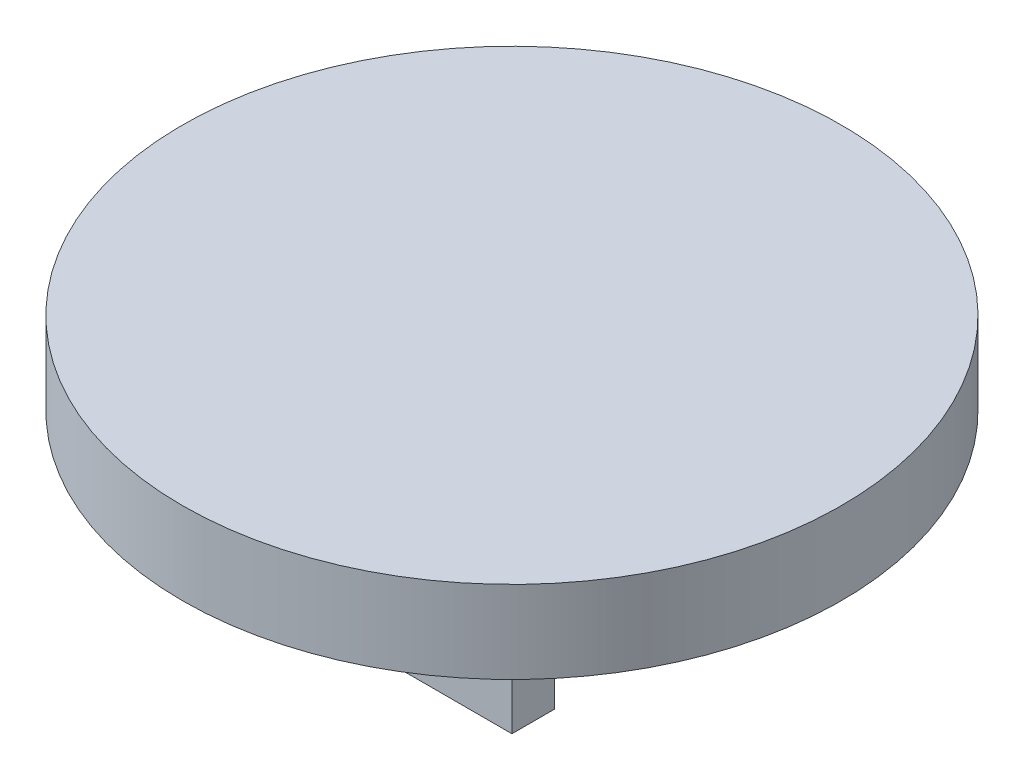
ISO-10303-21;
HEADER;
FILE_DESCRIPTION(('STEP AP214'),'2;1');
FILE_NAME('part.step','',(''),(''),'','','');
FILE_SCHEMA(('AUTOMOTIVE_DESIGN { 1 0 10303 214 1 1 1 1 }'));
ENDSEC;
DATA;
#1=APPLICATION_CONTEXT('core data for automotive mechanical design processes');
#2=APPLICATION_PROTOCOL_DEFINITION('international standard','automotive_design',2000,#1);
#3=PRODUCT_CONTEXT('',#1,'mechanical');
#4=PRODUCT('Part','Part','',(#3));
#5=PRODUCT_RELATED_PRODUCT_CATEGORY('part','',(#4));
#6=PRODUCT_DEFINITION_FORMATION('','',#4);
#7=PRODUCT_DEFINITION_CONTEXT('part definition',#1,'design');
#8=PRODUCT_DEFINITION('design','',#6,#7);
#9=PRODUCT_DEFINITION_SHAPE('','',#8);
#10=(LENGTH_UNIT() NAMED_UNIT(*) SI_UNIT(.MILLI.,.METRE.));
#11=(NAMED_UNIT(*) PLANE_ANGLE_UNIT() SI_UNIT($,.RADIAN.));
#12=(NAMED_UNIT(*) SI_UNIT($,.STERADIAN.) SOLID_ANGLE_UNIT());
#13=UNCERTAINTY_MEASURE_WITH_UNIT(LENGTH_MEASURE(1.E-05),#10,'distance_accuracy_value','');
#14=(GEOMETRIC_REPRESENTATION_CONTEXT(3) GLOBAL_UNCERTAINTY_ASSIGNED_CONTEXT((#13)) GLOBAL_UNIT_ASSIGNED_CONTEXT((#10,
#11,#12)) REPRESENTATION_CONTEXT('',''));
#15=CARTESIAN_POINT('',(0.,0.,0.));
#16=DIRECTION('',(0.,0.,1.));
#17=DIRECTION('',(1.,0.,0.));
#18=AXIS2_PLACEMENT_3D('',#15,#16,#17);
#19=CARTESIAN_POINT('',(0.,-3.,0.));
#20=DIRECTION('',(0.,-1.,0.));
#21=DIRECTION('',(0.,0.,-1.));
#22=AXIS2_PLACEMENT_3D('',#19,#20,#21);
#23=PLANE('',#22);
#24=DIRECTION('',(-1.,0.,0.));
#25=VECTOR('',#24,1.);
#26=CARTESIAN_POINT('',(0.,-3.,3.44343794684317));
#27=LINE('',#26,#25);
#28=CARTESIAN_POINT('',(-2.37672367471392,-3.,3.44343794684317));
#29=VERTEX_POINT('',#28);
#30=CARTESIAN_POINT('',(-5.,-3.,3.44343794684317));
#31=VERTEX_POINT('',#30);
#32=EDGE_CURVE('E192',#29,#31,#27,.T.);
#33=ORIENTED_EDGE('',*,*,#32,.F.);
#34=DIRECTION('',(0.,0.,-1.));
#35=VECTOR('',#34,1.);
#36=CARTESIAN_POINT('',(-2.37672367471392,-3.,0.));
#37=LINE('',#36,#35);
#38=CARTESIAN_POINT('',(-2.37672367471392,-3.,5.));
#39=VERTEX_POINT('',#38);
#40=EDGE_CURVE('E223',#39,#29,#37,.T.);
#41=ORIENTED_EDGE('',*,*,#40,.F.);
#42=DIRECTION('',(-1.,0.,0.));
#43=VECTOR('',#42,1.);
#44=CARTESIAN_POINT('',(-5.,-3.,5.));
#45=LINE('',#44,#43);
#46=CARTESIAN_POINT('',(-5.,-3.,5.));
#47=VERTEX_POINT('',#46);
#48=EDGE_CURVE('E239',#39,#47,#45,.T.);
#49=ORIENTED_EDGE('',*,*,#48,.T.);
#50=DIRECTION('',(0.,0.,-1.));
#51=VECTOR('',#50,1.);
#52=CARTESIAN_POINT('',(-5.,-3.,5.));
#53=LINE('',#52,#51);
#54=EDGE_CURVE('E242',#47,#31,#53,.T.);
#55=ORIENTED_EDGE('',*,*,#54,.T.);
#56=EDGE_LOOP('',(#33,#41,#49,#55));
#57=FACE_BOUND('',#56,.T.);
#58=ADVANCED_FACE('F33',(#57),#23,.T.);
#59=CARTESIAN_POINT('',(5.,-5.1951982939497,14.0225349811759));
#60=DIRECTION('',(0.,-1.,0.));
#61=DIRECTION('',(0.,0.,-1.));
#62=AXIS2_PLACEMENT_3D('',#59,#60,#61);
#63=PLANE('',#62);
#64=DIRECTION('',(-1.,0.,0.));
#65=VECTOR('',#64,1.);
#66=CARTESIAN_POINT('',(5.,-5.1951982939497,3.44343794684317));
#67=LINE('',#66,#65);
#68=CARTESIAN_POINT('',(5.,-5.1951982939497,3.44343794684317));
#69=VERTEX_POINT('',#68);
#70=CARTESIAN_POINT('',(-2.37672367471392,-5.1951982939497,3.44343794684317));
#71=VERTEX_POINT('',#70);
#72=EDGE_CURVE('E165',#69,#71,#67,.T.);
#73=ORIENTED_EDGE('',*,*,#72,.F.);
#74=DIRECTION('',(0.,0.,-1.));
#75=VECTOR('',#74,1.);
#76=CARTESIAN_POINT('',(5.,-5.1951982939497,14.0225349811759));
#77=LINE('',#76,#75);
#78=CARTESIAN_POINT('',(5.,-5.1951982939497,5.));
#79=VERTEX_POINT('',#78);
#80=EDGE_CURVE('E215',#79,#69,#77,.T.);
#81=ORIENTED_EDGE('',*,*,#80,.F.);
#82=DIRECTION('',(1.,0.,0.));
#83=VECTOR('',#82,1.);
#84=CARTESIAN_POINT('',(5.,-5.1951982939497,5.));
#85=LINE('',#84,#83);
#86=CARTESIAN_POINT('',(-2.37672367471392,-5.1951982939497,5.));
#87=VERTEX_POINT('',#86);
#88=EDGE_CURVE('E200',#87,#79,#85,.T.);
#89=ORIENTED_EDGE('',*,*,#88,.F.);
#90=DIRECTION('',(0.,0.,-1.));
#91=VECTOR('',#90,1.);
#92=CARTESIAN_POINT('',(-2.37672367471392,-5.1951982939497,14.0225349811759));
#93=LINE('',#92,#91);
#94=EDGE_CURVE('E211',#87,#71,#93,.T.);
#95=ORIENTED_EDGE('',*,*,#94,.T.);
#96=EDGE_LOOP('',(#73,#81,#89,#95));
#97=FACE_BOUND('',#96,.T.);
#98=ADVANCED_FACE('F295',(#97),#63,.T.);
#99=CARTESIAN_POINT('',(-2.37672367471392,0.,14.0225349811759));
#100=DIRECTION('',(-1.,0.,0.));
#101=DIRECTION('',(0.,0.,1.));
#102=AXIS2_PLACEMENT_3D('',#99,#100,#101);
#103=PLANE('',#102);
#104=DIRECTION('',(0.,1.,0.));
#105=VECTOR('',#104,1.);
#106=CARTESIAN_POINT('',(-2.37672367471392,0.,3.44343794684317));
#107=LINE('',#106,#105);
#108=EDGE_CURVE('E190',#71,#29,#107,.T.);
#109=ORIENTED_EDGE('',*,*,#108,.F.);
#110=ORIENTED_EDGE('',*,*,#94,.F.);
#111=DIRECTION('',(0.,-1.,0.));
#112=VECTOR('',#111,1.);
#113=CARTESIAN_POINT('',(-2.37672367471392,0.,5.));
#114=LINE('',#113,#112);
#115=EDGE_CURVE('E198',#39,#87,#114,.T.);
#116=ORIENTED_EDGE('',*,*,#115,.F.);
#117=ORIENTED_EDGE('',*,*,#40,.T.);
#118=EDGE_LOOP('',(#109,#110,#116,#117));
#119=FACE_BOUND('',#118,.T.);
#120=ADVANCED_FACE('F310',(#119),#103,.T.);
#121=DIRECTION('',(0.,-1.,0.));
#122=VECTOR('',#121,1.);
#123=CARTESIAN_POINT('',(-2.37672367471392,0.,-3.44343794684317));
#124=LINE('',#123,#122);
#125=CARTESIAN_POINT('',(-2.37672367471392,-3.,-3.44343794684317));
#126=VERTEX_POINT('',#125);
#127=CARTESIAN_POINT('',(-2.37672367471392,-5.1951982939497,-3.44343794684317));
#128=VERTEX_POINT('',#127);
#129=EDGE_CURVE('E49',#126,#128,#124,.T.);
#130=ORIENTED_EDGE('',*,*,#129,.F.);
#131=CARTESIAN_POINT('',(-2.37672367471392,-3.,-5.));
#132=VERTEX_POINT('',#131);
#133=EDGE_CURVE('E220',#126,#132,#37,.T.);
#134=ORIENTED_EDGE('',*,*,#133,.T.);
#135=DIRECTION('',(0.,1.,0.));
#136=VECTOR('',#135,1.);
#137=CARTESIAN_POINT('',(-2.37672367471392,0.,-5.));
#138=LINE('',#137,#136);
#139=CARTESIAN_POINT('',(-2.37672367471392,-5.1951982939497,-5.));
#140=VERTEX_POINT('',#139);
#141=EDGE_CURVE('E205',#140,#132,#138,.T.);
#142=ORIENTED_EDGE('',*,*,#141,.F.);
#143=EDGE_CURVE('E214',#128,#140,#93,.T.);
#144=ORIENTED_EDGE('',*,*,#143,.F.);
#145=EDGE_LOOP('',(#130,#134,#142,#144));
#146=FACE_BOUND('',#145,.T.);
#147=ADVANCED_FACE('F301',(#146),#103,.T.);
#148=CARTESIAN_POINT('',(0.,-3.0725292490332,-9.00000000000001));
#149=DIRECTION('',(0.,0.,1.));
#150=DIRECTION('',(1.,0.,0.));
#151=AXIS2_PLACEMENT_3D('',#148,#149,#150);
#152=CYLINDRICAL_SURFACE('',#151,0.5);
#153=CARTESIAN_POINT('',(0.,-3.0725292490332,3.44343794684317));
#154=DIRECTION('',(0.,0.,1.));
#155=DIRECTION('',(1.,0.,0.));
#156=AXIS2_PLACEMENT_3D('',#153,#154,#155);
#157=CIRCLE('',#156,0.5);
#158=CARTESIAN_POINT('',(0.5,-3.0725292490332,3.44343794684317));
#159=VERTEX_POINT('',#158);
#160=EDGE_CURVE('E187',#159,#159,#157,.F.);
#161=ORIENTED_EDGE('',*,*,#160,.T.);
#162=EDGE_LOOP('',(#161));
#163=FACE_BOUND('',#162,.T.);
#164=CARTESIAN_POINT('',(0.,-3.0725292490332,5.));
#165=DIRECTION('',(0.,0.,1.));
#166=DIRECTION('',(1.,0.,0.));
#167=AXIS2_PLACEMENT_3D('',#164,#165,#166);
#168=CIRCLE('',#167,0.5);
#169=CARTESIAN_POINT('',(0.5,-3.0725292490332,5.));
#170=VERTEX_POINT('',#169);
#171=EDGE_CURVE('E194',#170,#170,#168,.T.);
#172=ORIENTED_EDGE('',*,*,#171,.T.);
#173=EDGE_LOOP('',(#172));
#174=FACE_BOUND('',#173,.T.);
#175=ADVANCED_FACE('F286',(#163,#174),#152,.F.);
#176=CARTESIAN_POINT('',(0.,0.,0.));
#177=DIRECTION('',(0.,1.,0.));
#178=DIRECTION('',(0.,0.,1.));
#179=AXIS2_PLACEMENT_3D('',#176,#177,#178);
#180=PLANE('',#179);
#181=CARTESIAN_POINT('',(0.,0.,0.));
#182=DIRECTION('',(0.,1.,0.));
#183=DIRECTION('',(0.,0.,1.));
#184=AXIS2_PLACEMENT_3D('',#181,#182,#183);
#185=CIRCLE('',#184,12.);
#186=CARTESIAN_POINT('',(0.,0.,12.));
#187=VERTEX_POINT('',#186);
#188=EDGE_CURVE('E267',#187,#187,#185,.T.);
#189=ORIENTED_EDGE('',*,*,#188,.F.);
#190=EDGE_LOOP('',(#189));
#191=FACE_BOUND('',#190,.T.);
#192=DIRECTION('',(-1.,0.,0.));
#193=VECTOR('',#192,1.);
#194=CARTESIAN_POINT('',(-5.,0.,5.));
#195=LINE('',#194,#193);
#196=CARTESIAN_POINT('',(5.,0.,5.));
#197=VERTEX_POINT('',#196);
#198=CARTESIAN_POINT('',(-5.,0.,5.));
#199=VERTEX_POINT('',#198);
#200=EDGE_CURVE('E250',#197,#199,#195,.T.);
#201=ORIENTED_EDGE('',*,*,#200,.F.);
#202=DIRECTION('',(0.,0.,1.));
#203=VECTOR('',#202,1.);
#204=CARTESIAN_POINT('',(5.,0.,5.));
#205=LINE('',#204,#203);
#206=CARTESIAN_POINT('',(5.,0.,-5.));
#207=VERTEX_POINT('',#206);
#208=EDGE_CURVE('E236',#207,#197,#205,.T.);
#209=ORIENTED_EDGE('',*,*,#208,.F.);
#210=DIRECTION('',(1.,0.,0.));
#211=VECTOR('',#210,1.);
#212=CARTESIAN_POINT('',(-5.,0.,-5.));
#213=LINE('',#212,#211);
#214=CARTESIAN_POINT('',(-5.,0.,-5.));
#215=VERTEX_POINT('',#214);
#216=EDGE_CURVE('E241',#215,#207,#213,.T.);
#217=ORIENTED_EDGE('',*,*,#216,.F.);
#218=DIRECTION('',(0.,0.,-1.));
#219=VECTOR('',#218,1.);
#220=CARTESIAN_POINT('',(-5.,0.,5.));
#221=LINE('',#220,#219);
#222=EDGE_CURVE('E252',#199,#215,#221,.T.);
#223=ORIENTED_EDGE('',*,*,#222,.F.);
#224=EDGE_LOOP('',(#201,#209,#217,#223));
#225=FACE_BOUND('',#224,.T.);
#226=ADVANCED_FACE('F300',(#191,#225),#180,.F.);
#227=DIRECTION('',(1.,0.,0.));
#228=VECTOR('',#227,1.);
#229=CARTESIAN_POINT('',(0.,-3.,-3.44343794684317));
#230=LINE('',#229,#228);
#231=CARTESIAN_POINT('',(-5.,-3.,-3.44343794684317));
#232=VERTEX_POINT('',#231);
#233=EDGE_CURVE('E184',#232,#126,#230,.T.);
#234=ORIENTED_EDGE('',*,*,#233,.F.);
#235=CARTESIAN_POINT('',(-5.,-3.,-5.));
#236=VERTEX_POINT('',#235);
#237=EDGE_CURVE('E170',#232,#236,#53,.T.);
#238=ORIENTED_EDGE('',*,*,#237,.T.);
#239=DIRECTION('',(1.,0.,0.));
#240=VECTOR('',#239,1.);
#241=CARTESIAN_POINT('',(-5.,-3.,-5.));
#242=LINE('',#241,#240);
#243=EDGE_CURVE('E245',#236,#132,#242,.T.);
#244=ORIENTED_EDGE('',*,*,#243,.T.);
#245=ORIENTED_EDGE('',*,*,#133,.F.);
#246=EDGE_LOOP('',(#234,#238,#244,#245));
#247=FACE_BOUND('',#246,.T.);
#248=ADVANCED_FACE('F306',(#247),#23,.T.);
#249=CARTESIAN_POINT('',(0.,3.,0.));
#250=DIRECTION('',(0.,-1.,0.));
#251=DIRECTION('',(0.,0.,-1.));
#252=AXIS2_PLACEMENT_3D('',#249,#250,#251);
#253=CYLINDRICAL_SURFACE('',#252,12.);
#254=CARTESIAN_POINT('',(0.,3.,0.));
#255=DIRECTION('',(0.,1.,0.));
#256=DIRECTION('',(0.,0.,1.));
#257=AXIS2_PLACEMENT_3D('',#254,#255,#256);
#258=CIRCLE('',#257,12.);
#259=CARTESIAN_POINT('',(0.,3.,12.));
#260=VERTEX_POINT('',#259);
#261=EDGE_CURVE('E268',#260,#260,#258,.T.);
#262=ORIENTED_EDGE('',*,*,#261,.F.);
#263=EDGE_LOOP('',(#262));
#264=FACE_BOUND('',#263,.T.);
#265=ORIENTED_EDGE('',*,*,#188,.T.);
#266=EDGE_LOOP('',(#265));
#267=FACE_BOUND('',#266,.T.);
#268=ADVANCED_FACE('F35',(#264,#267),#253,.T.);
#269=CARTESIAN_POINT('',(0.,3.,0.));
#270=DIRECTION('',(0.,1.,0.));
#271=DIRECTION('',(0.,0.,1.));
#272=AXIS2_PLACEMENT_3D('',#269,#270,#271);
#273=PLANE('',#272);
#274=ORIENTED_EDGE('',*,*,#261,.T.);
#275=EDGE_LOOP('',(#274));
#276=FACE_BOUND('',#275,.T.);
#277=ADVANCED_FACE('F321',(#276),#273,.T.);
#278=CARTESIAN_POINT('',(5.,-3.,5.));
#279=DIRECTION('',(-1.,0.,0.));
#280=DIRECTION('',(0.,0.,1.));
#281=AXIS2_PLACEMENT_3D('',#278,#279,#280);
#282=PLANE('',#281);
#283=ORIENTED_EDGE('',*,*,#80,.T.);
#284=DIRECTION('',(0.,-1.,0.));
#285=VECTOR('',#284,1.);
#286=CARTESIAN_POINT('',(5.,-0.195198293949695,3.44343794684317));
#287=LINE('',#286,#285);
#288=CARTESIAN_POINT('',(5.,-0.195198293949695,3.44343794684317));
#289=VERTEX_POINT('',#288);
#290=EDGE_CURVE('E172',#289,#69,#287,.T.);
#291=ORIENTED_EDGE('',*,*,#290,.F.);
#292=DIRECTION('',(0.,0.,1.));
#293=VECTOR('',#292,1.);
#294=CARTESIAN_POINT('',(5.,-0.195198293949695,3.44343794684317));
#295=LINE('',#294,#293);
#296=CARTESIAN_POINT('',(5.,-0.195198293949695,-3.44343794684317));
#297=VERTEX_POINT('',#296);
#298=EDGE_CURVE('E155',#297,#289,#295,.T.);
#299=ORIENTED_EDGE('',*,*,#298,.F.);
#300=DIRECTION('',(0.,-1.,0.));
#301=VECTOR('',#300,1.);
#302=CARTESIAN_POINT('',(5.,-0.195198293949695,-3.44343794684317));
#303=LINE('',#302,#301);
#304=CARTESIAN_POINT('',(5.,-5.1951982939497,-3.44343794684317));
#305=VERTEX_POINT('',#304);
#306=EDGE_CURVE('E152',#297,#305,#303,.T.);
#307=ORIENTED_EDGE('',*,*,#306,.T.);
#308=CARTESIAN_POINT('',(5.,-5.1951982939497,-5.));
#309=VERTEX_POINT('',#308);
#310=EDGE_CURVE('E208',#305,#309,#77,.T.);
#311=ORIENTED_EDGE('',*,*,#310,.T.);
#312=DIRECTION('',(0.,1.,0.));
#313=VECTOR('',#312,1.);
#314=CARTESIAN_POINT('',(5.,-3.,-5.));
#315=LINE('',#314,#313);
#316=EDGE_CURVE('E248',#309,#207,#315,.T.);
#317=ORIENTED_EDGE('',*,*,#316,.T.);
#318=ORIENTED_EDGE('',*,*,#208,.T.);
#319=DIRECTION('',(0.,1.,0.));
#320=VECTOR('',#319,1.);
#321=CARTESIAN_POINT('',(5.,-3.,5.));
#322=LINE('',#321,#320);
#323=EDGE_CURVE('E264',#79,#197,#322,.T.);
#324=ORIENTED_EDGE('',*,*,#323,.F.);
#325=EDGE_LOOP('',(#283,#291,#299,#307,#311,#317,#318,#324));
#326=FACE_BOUND('',#325,.T.);
#327=ADVANCED_FACE('F344',(#326),#282,.F.);
#328=CARTESIAN_POINT('',(-5.,-3.,5.));
#329=DIRECTION('',(0.,0.,-1.));
#330=DIRECTION('',(-1.,0.,0.));
#331=AXIS2_PLACEMENT_3D('',#328,#329,#330);
#332=PLANE('',#331);
#333=ORIENTED_EDGE('',*,*,#171,.F.);
#334=EDGE_LOOP('',(#333));
#335=FACE_BOUND('',#334,.T.);
#336=ORIENTED_EDGE('',*,*,#48,.F.);
#337=ORIENTED_EDGE('',*,*,#115,.T.);
#338=ORIENTED_EDGE('',*,*,#88,.T.);
#339=ORIENTED_EDGE('',*,*,#323,.T.);
#340=ORIENTED_EDGE('',*,*,#200,.T.);
#341=DIRECTION('',(0.,1.,0.));
#342=VECTOR('',#341,1.);
#343=CARTESIAN_POINT('',(-5.,-3.,5.));
#344=LINE('',#343,#342);
#345=EDGE_CURVE('E261',#47,#199,#344,.T.);
#346=ORIENTED_EDGE('',*,*,#345,.F.);
#347=EDGE_LOOP('',(#336,#337,#338,#339,#340,#346));
#348=FACE_BOUND('',#347,.T.);
#349=ADVANCED_FACE('F349',(#335,#348),#332,.F.);
#350=CARTESIAN_POINT('',(-5.,-3.,5.));
#351=DIRECTION('',(1.,0.,0.));
#352=DIRECTION('',(0.,0.,-1.));
#353=AXIS2_PLACEMENT_3D('',#350,#351,#352);
#354=PLANE('',#353);
#355=DIRECTION('',(0.,0.,-1.));
#356=VECTOR('',#355,1.);
#357=CARTESIAN_POINT('',(-5.,-0.195198293949695,3.44343794684317));
#358=LINE('',#357,#356);
#359=CARTESIAN_POINT('',(-5.,-0.195198293949695,3.44343794684317));
#360=VERTEX_POINT('',#359);
#361=CARTESIAN_POINT('',(-5.,-0.195198293949695,-3.44343794684317));
#362=VERTEX_POINT('',#361);
#363=EDGE_CURVE('E156',#360,#362,#358,.T.);
#364=ORIENTED_EDGE('',*,*,#363,.F.);
#365=DIRECTION('',(0.,-1.,0.));
#366=VECTOR('',#365,1.);
#367=CARTESIAN_POINT('',(-5.,-0.195198293949695,3.44343794684317));
#368=LINE('',#367,#366);
#369=EDGE_CURVE('E179',#360,#31,#368,.T.);
#370=ORIENTED_EDGE('',*,*,#369,.T.);
#371=ORIENTED_EDGE('',*,*,#54,.F.);
#372=ORIENTED_EDGE('',*,*,#345,.T.);
#373=ORIENTED_EDGE('',*,*,#222,.T.);
#374=DIRECTION('',(0.,1.,0.));
#375=VECTOR('',#374,1.);
#376=CARTESIAN_POINT('',(-5.,-3.,-5.));
#377=LINE('',#376,#375);
#378=EDGE_CURVE('E258',#236,#215,#377,.T.);
#379=ORIENTED_EDGE('',*,*,#378,.F.);
#380=ORIENTED_EDGE('',*,*,#237,.F.);
#381=DIRECTION('',(0.,-1.,0.));
#382=VECTOR('',#381,1.);
#383=CARTESIAN_POINT('',(-5.,-0.195198293949695,-3.44343794684317));
#384=LINE('',#383,#382);
#385=EDGE_CURVE('E149',#362,#232,#384,.T.);
#386=ORIENTED_EDGE('',*,*,#385,.F.);
#387=EDGE_LOOP('',(#364,#370,#371,#372,#373,#379,#380,#386));
#388=FACE_BOUND('',#387,.T.);
#389=ADVANCED_FACE('F168',(#388),#354,.F.);
#390=CARTESIAN_POINT('',(-5.,-3.,-5.));
#391=DIRECTION('',(0.,0.,1.));
#392=DIRECTION('',(1.,0.,0.));
#393=AXIS2_PLACEMENT_3D('',#390,#391,#392);
#394=PLANE('',#393);
#395=CARTESIAN_POINT('',(0.,-3.0725292490332,-5.));
#396=DIRECTION('',(0.,0.,1.));
#397=DIRECTION('',(1.,0.,0.));
#398=AXIS2_PLACEMENT_3D('',#395,#396,#397);
#399=CIRCLE('',#398,0.5);
#400=CARTESIAN_POINT('',(0.5,-3.0725292490332,-5.));
#401=VERTEX_POINT('',#400);
#402=EDGE_CURVE('E197',#401,#401,#399,.T.);
#403=ORIENTED_EDGE('',*,*,#402,.T.);
#404=EDGE_LOOP('',(#403));
#405=FACE_BOUND('',#404,.T.);
#406=ORIENTED_EDGE('',*,*,#216,.T.);
#407=ORIENTED_EDGE('',*,*,#316,.F.);
#408=DIRECTION('',(-1.,0.,0.));
#409=VECTOR('',#408,1.);
#410=CARTESIAN_POINT('',(5.,-5.1951982939497,-5.));
#411=LINE('',#410,#409);
#412=EDGE_CURVE('E202',#309,#140,#411,.T.);
#413=ORIENTED_EDGE('',*,*,#412,.T.);
#414=ORIENTED_EDGE('',*,*,#141,.T.);
#415=ORIENTED_EDGE('',*,*,#243,.F.);
#416=ORIENTED_EDGE('',*,*,#378,.T.);
#417=EDGE_LOOP('',(#406,#407,#413,#414,#415,#416));
#418=FACE_BOUND('',#417,.T.);
#419=ADVANCED_FACE('F277',(#405,#418),#394,.F.);
#420=DIRECTION('',(1.,0.,0.));
#421=VECTOR('',#420,1.);
#422=CARTESIAN_POINT('',(5.,-5.1951982939497,-3.44343794684317));
#423=LINE('',#422,#421);
#424=EDGE_CURVE('E331',#128,#305,#423,.T.);
#425=ORIENTED_EDGE('',*,*,#424,.F.);
#426=ORIENTED_EDGE('',*,*,#143,.T.);
#427=ORIENTED_EDGE('',*,*,#412,.F.);
#428=ORIENTED_EDGE('',*,*,#310,.F.);
#429=EDGE_LOOP('',(#425,#426,#427,#428));
#430=FACE_BOUND('',#429,.T.);
#431=ADVANCED_FACE('F283',(#430),#63,.T.);
#432=CARTESIAN_POINT('',(0.,-3.0725292490332,-3.44343794684317));
#433=DIRECTION('',(0.,0.,-1.));
#434=DIRECTION('',(-1.,0.,0.));
#435=AXIS2_PLACEMENT_3D('',#432,#433,#434);
#436=CIRCLE('',#435,0.5);
#437=CARTESIAN_POINT('',(-0.5,-3.0725292490332,-3.44343794684317));
#438=VERTEX_POINT('',#437);
#439=EDGE_CURVE('E37',#438,#438,#436,.F.);
#440=ORIENTED_EDGE('',*,*,#439,.T.);
#441=EDGE_LOOP('',(#440));
#442=FACE_BOUND('',#441,.T.);
#443=ORIENTED_EDGE('',*,*,#402,.F.);
#444=EDGE_LOOP('',(#443));
#445=FACE_BOUND('',#444,.T.);
#446=ADVANCED_FACE('F280',(#442,#445),#152,.F.);
#447=CARTESIAN_POINT('',(5.,-0.195198293949695,3.44343794684317));
#448=DIRECTION('',(0.,0.,1.));
#449=DIRECTION('',(1.,0.,0.));
#450=AXIS2_PLACEMENT_3D('',#447,#448,#449);
#451=PLANE('',#450);
#452=ORIENTED_EDGE('',*,*,#32,.T.);
#453=ORIENTED_EDGE('',*,*,#369,.F.);
#454=DIRECTION('',(-1.,0.,0.));
#455=VECTOR('',#454,1.);
#456=CARTESIAN_POINT('',(5.,-0.195198293949695,3.44343794684317));
#457=LINE('',#456,#455);
#458=EDGE_CURVE('E162',#289,#360,#457,.T.);
#459=ORIENTED_EDGE('',*,*,#458,.F.);
#460=ORIENTED_EDGE('',*,*,#290,.T.);
#461=ORIENTED_EDGE('',*,*,#72,.T.);
#462=ORIENTED_EDGE('',*,*,#108,.T.);
#463=EDGE_LOOP('',(#452,#453,#459,#460,#461,#462));
#464=FACE_BOUND('',#463,.T.);
#465=ORIENTED_EDGE('',*,*,#160,.F.);
#466=EDGE_LOOP('',(#465));
#467=FACE_BOUND('',#466,.T.);
#468=ADVANCED_FACE('F282',(#464,#467),#451,.F.);
#469=CARTESIAN_POINT('',(5.,-0.195198293949695,-3.44343794684317));
#470=DIRECTION('',(0.,0.,-1.));
#471=DIRECTION('',(-1.,0.,0.));
#472=AXIS2_PLACEMENT_3D('',#469,#470,#471);
#473=PLANE('',#472);
#474=ORIENTED_EDGE('',*,*,#129,.T.);
#475=ORIENTED_EDGE('',*,*,#424,.T.);
#476=ORIENTED_EDGE('',*,*,#306,.F.);
#477=DIRECTION('',(1.,0.,0.));
#478=VECTOR('',#477,1.);
#479=CARTESIAN_POINT('',(5.,-0.195198293949695,-3.44343794684317));
#480=LINE('',#479,#478);
#481=EDGE_CURVE('E144',#362,#297,#480,.T.);
#482=ORIENTED_EDGE('',*,*,#481,.F.);
#483=ORIENTED_EDGE('',*,*,#385,.T.);
#484=ORIENTED_EDGE('',*,*,#233,.T.);
#485=EDGE_LOOP('',(#474,#475,#476,#482,#483,#484));
#486=FACE_BOUND('',#485,.T.);
#487=ORIENTED_EDGE('',*,*,#439,.F.);
#488=EDGE_LOOP('',(#487));
#489=FACE_BOUND('',#488,.T.);
#490=ADVANCED_FACE('F146',(#486,#489),#473,.F.);
#491=CARTESIAN_POINT('',(0.,-0.195198293949695,0.));
#492=DIRECTION('',(0.,1.,0.));
#493=DIRECTION('',(0.,0.,1.));
#494=AXIS2_PLACEMENT_3D('',#491,#492,#493);
#495=PLANE('',#494);
#496=ORIENTED_EDGE('',*,*,#363,.T.);
#497=ORIENTED_EDGE('',*,*,#481,.T.);
#498=ORIENTED_EDGE('',*,*,#298,.T.);
#499=ORIENTED_EDGE('',*,*,#458,.T.);
#500=EDGE_LOOP('',(#496,#497,#498,#499));
#501=FACE_BOUND('',#500,.T.);
#502=DIRECTION('',(0.,0.,1.));
#503=VECTOR('',#502,1.);
#504=CARTESIAN_POINT('',(-4.,-0.195198293949695,0.));
#505=LINE('',#504,#503);
#506=CARTESIAN_POINT('',(-4.,-0.195198293949695,-1.81140085793888));
#507=VERTEX_POINT('',#506);
#508=CARTESIAN_POINT('',(-4.,-0.195198293949695,1.81140085793888));
#509=VERTEX_POINT('',#508);
#510=EDGE_CURVE('E56',#507,#509,#505,.T.);
#511=ORIENTED_EDGE('',*,*,#510,.T.);
#512=DIRECTION('',(1.,0.,0.));
#513=VECTOR('',#512,1.);
#514=CARTESIAN_POINT('',(-4.,-0.195198293949695,1.81140085793888));
#515=LINE('',#514,#513);
#516=CARTESIAN_POINT('',(-2.37672367471392,-0.195198293949695,1.81140085793888));
#517=VERTEX_POINT('',#516);
#518=EDGE_CURVE('E11',#509,#517,#515,.T.);
#519=ORIENTED_EDGE('',*,*,#518,.T.);
#520=DIRECTION('',(0.,0.,-1.));
#521=VECTOR('',#520,1.);
#522=CARTESIAN_POINT('',(-2.37672367471392,-0.195198293949695,14.0225349811759));
#523=LINE('',#522,#521);
#524=CARTESIAN_POINT('',(-2.37672367471392,-0.195198293949695,-1.81140085793888));
#525=VERTEX_POINT('',#524);
#526=EDGE_CURVE('E178',#517,#525,#523,.T.);
#527=ORIENTED_EDGE('',*,*,#526,.T.);
#528=DIRECTION('',(1.,0.,0.));
#529=VECTOR('',#528,1.);
#530=CARTESIAN_POINT('',(-4.,-0.195198293949695,-1.81140085793888));
#531=LINE('',#530,#529);
#532=EDGE_CURVE('E181',#507,#525,#531,.T.);
#533=ORIENTED_EDGE('',*,*,#532,.F.);
#534=EDGE_LOOP('',(#511,#519,#527,#533));
#535=FACE_BOUND('',#534,.T.);
#536=ADVANCED_FACE('F160',(#501,#535),#495,.F.);
#537=DIRECTION('',(1.,0.,0.));
#538=VECTOR('',#537,1.);
#539=CARTESIAN_POINT('',(-4.,0.,-1.81140085793888));
#540=LINE('',#539,#538);
#541=CARTESIAN_POINT('',(-4.,0.,-1.81140085793888));
#542=VERTEX_POINT('',#541);
#543=CARTESIAN_POINT('',(-2.37672367471392,0.,-1.81140085793888));
#544=VERTEX_POINT('',#543);
#545=EDGE_CURVE('E232',#542,#544,#540,.T.);
#546=ORIENTED_EDGE('',*,*,#545,.T.);
#547=DIRECTION('',(0.,0.,-1.));
#548=VECTOR('',#547,1.);
#549=CARTESIAN_POINT('',(-2.37672367471392,0.,14.0225349811759));
#550=LINE('',#549,#548);
#551=CARTESIAN_POINT('',(-2.37672367471392,0.,1.81140085793888));
#552=VERTEX_POINT('',#551);
#553=EDGE_CURVE('E201',#552,#544,#550,.T.);
#554=ORIENTED_EDGE('',*,*,#553,.F.);
#555=DIRECTION('',(1.,0.,0.));
#556=VECTOR('',#555,1.);
#557=CARTESIAN_POINT('',(-4.,0.,1.81140085793888));
#558=LINE('',#557,#556);
#559=CARTESIAN_POINT('',(-4.,0.,1.81140085793888));
#560=VERTEX_POINT('',#559);
#561=EDGE_CURVE('E233',#560,#552,#558,.T.);
#562=ORIENTED_EDGE('',*,*,#561,.F.);
#563=DIRECTION('',(0.,0.,1.));
#564=VECTOR('',#563,1.);
#565=CARTESIAN_POINT('',(-4.,0.,0.));
#566=LINE('',#565,#564);
#567=EDGE_CURVE('E227',#542,#560,#566,.T.);
#568=ORIENTED_EDGE('',*,*,#567,.F.);
#569=EDGE_LOOP('',(#546,#554,#562,#568));
#570=FACE_BOUND('',#569,.T.);
#571=ADVANCED_FACE('F324',(#570),#180,.F.);
#572=CARTESIAN_POINT('',(-4.,0.,1.81140085793888));
#573=DIRECTION('',(0.,0.,-1.));
#574=DIRECTION('',(-1.,0.,0.));
#575=AXIS2_PLACEMENT_3D('',#572,#573,#574);
#576=PLANE('',#575);
#577=ORIENTED_EDGE('',*,*,#518,.F.);
#578=DIRECTION('',(0.,1.,0.));
#579=VECTOR('',#578,1.);
#580=CARTESIAN_POINT('',(-4.,0.,1.81140085793888));
#581=LINE('',#580,#579);
#582=EDGE_CURVE('E230',#509,#560,#581,.T.);
#583=ORIENTED_EDGE('',*,*,#582,.T.);
#584=ORIENTED_EDGE('',*,*,#561,.T.);
#585=DIRECTION('',(0.,1.,0.));
#586=VECTOR('',#585,1.);
#587=CARTESIAN_POINT('',(-2.37672367471392,0.,1.81140085793888));
#588=LINE('',#587,#586);
#589=EDGE_CURVE('E222',#517,#552,#588,.T.);
#590=ORIENTED_EDGE('',*,*,#589,.F.);
#591=EDGE_LOOP('',(#577,#583,#584,#590));
#592=FACE_BOUND('',#591,.T.);
#593=ADVANCED_FACE('F373',(#592),#576,.T.);
#594=CARTESIAN_POINT('',(-4.,0.,-1.81140085793888));
#595=DIRECTION('',(0.,0.,-1.));
#596=DIRECTION('',(0.,1.,0.));
#597=AXIS2_PLACEMENT_3D('',#594,#595,#596);
#598=PLANE('',#597);
#599=DIRECTION('',(0.,1.,0.));
#600=VECTOR('',#599,1.);
#601=CARTESIAN_POINT('',(-4.,0.,-1.81140085793888));
#602=LINE('',#601,#600);
#603=EDGE_CURVE('E225',#507,#542,#602,.T.);
#604=ORIENTED_EDGE('',*,*,#603,.F.);
#605=ORIENTED_EDGE('',*,*,#532,.T.);
#606=DIRECTION('',(0.,1.,0.));
#607=VECTOR('',#606,1.);
#608=CARTESIAN_POINT('',(-2.37672367471392,0.,-1.81140085793888));
#609=LINE('',#608,#607);
#610=EDGE_CURVE('E42',#525,#544,#609,.T.);
#611=ORIENTED_EDGE('',*,*,#610,.T.);
#612=ORIENTED_EDGE('',*,*,#545,.F.);
#613=EDGE_LOOP('',(#604,#605,#611,#612));
#614=FACE_BOUND('',#613,.T.);
#615=ADVANCED_FACE('F379',(#614),#598,.F.);
#616=CARTESIAN_POINT('',(-4.,0.,0.));
#617=DIRECTION('',(1.,0.,0.));
#618=DIRECTION('',(0.,0.,-1.));
#619=AXIS2_PLACEMENT_3D('',#616,#617,#618);
#620=PLANE('',#619);
#621=ORIENTED_EDGE('',*,*,#510,.F.);
#622=ORIENTED_EDGE('',*,*,#603,.T.);
#623=ORIENTED_EDGE('',*,*,#567,.T.);
#624=ORIENTED_EDGE('',*,*,#582,.F.);
#625=EDGE_LOOP('',(#621,#622,#623,#624));
#626=FACE_BOUND('',#625,.T.);
#627=ADVANCED_FACE('F396',(#626),#620,.T.);
#628=ORIENTED_EDGE('',*,*,#526,.F.);
#629=ORIENTED_EDGE('',*,*,#589,.T.);
#630=ORIENTED_EDGE('',*,*,#553,.T.);
#631=ORIENTED_EDGE('',*,*,#610,.F.);
#632=EDGE_LOOP('',(#628,#629,#630,#631));
#633=FACE_BOUND('',#632,.T.);
#634=ADVANCED_FACE('F392',(#633),#103,.T.);
#635=CLOSED_SHELL('',(#58,#98,#120,#147,#175,#226,#248,#268,#277,#327,#349,#389,#419,#431,#446,
#468,#490,#536,#571,#593,#615,#627,#634));
#636=MANIFOLD_SOLID_BREP('B2',#635);
#637=ADVANCED_BREP_SHAPE_REPRESENTATION('',(#18,#636),#14);
#638=SHAPE_DEFINITION_REPRESENTATION(#9,#637);
ENDSEC;
END-ISO-10303-21;
